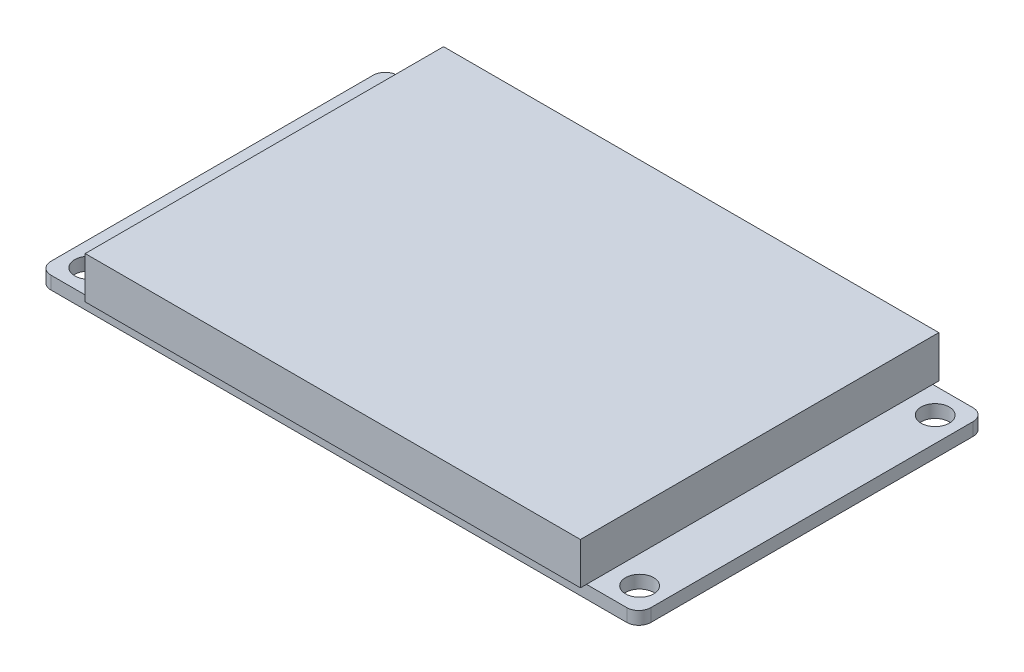
ISO-10303-21;
HEADER;
FILE_DESCRIPTION(('STEP AP214'),'2;1');
FILE_NAME('part.step','',(''),(''),'','','');
FILE_SCHEMA(('AUTOMOTIVE_DESIGN { 1 0 10303 214 1 1 1 1 }'));
ENDSEC;
DATA;
#1=APPLICATION_CONTEXT('core data for automotive mechanical design processes');
#2=APPLICATION_PROTOCOL_DEFINITION('international standard','automotive_design',2000,#1);
#3=PRODUCT_CONTEXT('',#1,'mechanical');
#4=PRODUCT('Part','Part','',(#3));
#5=PRODUCT_RELATED_PRODUCT_CATEGORY('part','',(#4));
#6=PRODUCT_DEFINITION_FORMATION('','',#4);
#7=PRODUCT_DEFINITION_CONTEXT('part definition',#1,'design');
#8=PRODUCT_DEFINITION('design','',#6,#7);
#9=PRODUCT_DEFINITION_SHAPE('','',#8);
#10=(LENGTH_UNIT() NAMED_UNIT(*) SI_UNIT(.MILLI.,.METRE.));
#11=(NAMED_UNIT(*) PLANE_ANGLE_UNIT() SI_UNIT($,.RADIAN.));
#12=(NAMED_UNIT(*) SI_UNIT($,.STERADIAN.) SOLID_ANGLE_UNIT());
#13=UNCERTAINTY_MEASURE_WITH_UNIT(LENGTH_MEASURE(1.E-05),#10,'distance_accuracy_value','');
#14=(GEOMETRIC_REPRESENTATION_CONTEXT(3) GLOBAL_UNCERTAINTY_ASSIGNED_CONTEXT((#13)) GLOBAL_UNIT_ASSIGNED_CONTEXT((#10,
#11,#12)) REPRESENTATION_CONTEXT('',''));
#15=CARTESIAN_POINT('',(0.,0.,0.));
#16=DIRECTION('',(0.,0.,1.));
#17=DIRECTION('',(1.,0.,0.));
#18=AXIS2_PLACEMENT_3D('',#15,#16,#17);
#19=CARTESIAN_POINT('',(73.,1.6,-1.5));
#20=DIRECTION('',(0.,-1.,0.));
#21=DIRECTION('',(0.,0.,-1.));
#22=AXIS2_PLACEMENT_3D('',#19,#20,#21);
#23=PLANE('',#22);
#24=CARTESIAN_POINT('',(71.45,1.6,-3.14999999999999));
#25=DIRECTION('',(0.,1.,0.));
#26=DIRECTION('',(0.,0.,1.));
#27=AXIS2_PLACEMENT_3D('',#24,#25,#26);
#28=CIRCLE('',#27,1.75);
#29=CARTESIAN_POINT('',(71.45,1.6,-1.4));
#30=VERTEX_POINT('',#29);
#31=EDGE_CURVE('E166',#30,#30,#28,.T.);
#32=ORIENTED_EDGE('',*,*,#31,.F.);
#33=EDGE_LOOP('',(#32));
#34=FACE_BOUND('',#33,.T.);
#35=CARTESIAN_POINT('',(71.45,1.6,-39.85));
#36=DIRECTION('',(0.,1.,0.));
#37=DIRECTION('',(0.,0.,1.));
#38=AXIS2_PLACEMENT_3D('',#35,#36,#37);
#39=CIRCLE('',#38,1.75);
#40=CARTESIAN_POINT('',(71.45,1.6,-38.1));
#41=VERTEX_POINT('',#40);
#42=EDGE_CURVE('E175',#41,#41,#39,.T.);
#43=ORIENTED_EDGE('',*,*,#42,.F.);
#44=EDGE_LOOP('',(#43));
#45=FACE_BOUND('',#44,.T.);
#46=DIRECTION('',(0.,0.,-1.));
#47=VECTOR('',#46,1.);
#48=CARTESIAN_POINT('',(68.,1.6,-43.75));
#49=LINE('',#48,#47);
#50=CARTESIAN_POINT('',(68.,1.6,0.));
#51=VERTEX_POINT('',#50);
#52=CARTESIAN_POINT('',(68.,1.6,-43.));
#53=VERTEX_POINT('',#52);
#54=EDGE_CURVE('E11',#51,#53,#49,.T.);
#55=ORIENTED_EDGE('',*,*,#54,.F.);
#56=DIRECTION('',(1.,0.,0.));
#57=VECTOR('',#56,1.);
#58=CARTESIAN_POINT('',(1.50000000000001,1.6,0.));
#59=LINE('',#58,#57);
#60=CARTESIAN_POINT('',(73.,1.6,0.));
#61=VERTEX_POINT('',#60);
#62=EDGE_CURVE('E211',#51,#61,#59,.T.);
#63=ORIENTED_EDGE('',*,*,#62,.T.);
#64=CARTESIAN_POINT('',(73.,1.6,-1.5));
#65=DIRECTION('',(0.,1.,0.));
#66=DIRECTION('',(0.,0.,-1.));
#67=AXIS2_PLACEMENT_3D('',#64,#65,#66);
#68=CIRCLE('',#67,1.5);
#69=CARTESIAN_POINT('',(74.5,1.6,-1.50000000000001));
#70=VERTEX_POINT('',#69);
#71=EDGE_CURVE('E193',#61,#70,#68,.T.);
#72=ORIENTED_EDGE('',*,*,#71,.T.);
#73=DIRECTION('',(0.,0.,-1.));
#74=VECTOR('',#73,1.);
#75=CARTESIAN_POINT('',(74.5,1.6,-1.50000000000001));
#76=LINE('',#75,#74);
#77=CARTESIAN_POINT('',(74.5,1.6,-41.5));
#78=VERTEX_POINT('',#77);
#79=EDGE_CURVE('E196',#70,#78,#76,.T.);
#80=ORIENTED_EDGE('',*,*,#79,.T.);
#81=CARTESIAN_POINT('',(73.,1.6,-41.5));
#82=DIRECTION('',(0.,1.,0.));
#83=DIRECTION('',(0.,0.,1.));
#84=AXIS2_PLACEMENT_3D('',#81,#82,#83);
#85=CIRCLE('',#84,1.5);
#86=CARTESIAN_POINT('',(73.,1.6,-43.));
#87=VERTEX_POINT('',#86);
#88=EDGE_CURVE('E199',#78,#87,#85,.T.);
#89=ORIENTED_EDGE('',*,*,#88,.T.);
#90=DIRECTION('',(-1.,0.,0.));
#91=VECTOR('',#90,1.);
#92=CARTESIAN_POINT('',(1.50000000000001,1.6,-43.));
#93=LINE('',#92,#91);
#94=EDGE_CURVE('E202',#87,#53,#93,.T.);
#95=ORIENTED_EDGE('',*,*,#94,.T.);
#96=EDGE_LOOP('',(#55,#63,#72,#80,#89,#95));
#97=FACE_BOUND('',#96,.T.);
#98=ADVANCED_FACE('F35',(#34,#45,#97),#23,.F.);
#99=CARTESIAN_POINT('',(3.04999999999999,1.6,-3.14999999999999));
#100=DIRECTION('',(0.,1.,0.));
#101=DIRECTION('',(0.,0.,1.));
#102=AXIS2_PLACEMENT_3D('',#99,#100,#101);
#103=CIRCLE('',#102,1.75);
#104=CARTESIAN_POINT('',(3.04999999999999,1.6,-1.39999999999999));
#105=VERTEX_POINT('',#104);
#106=EDGE_CURVE('E181',#105,#105,#103,.T.);
#107=ORIENTED_EDGE('',*,*,#106,.F.);
#108=EDGE_LOOP('',(#107));
#109=FACE_BOUND('',#108,.T.);
#110=CARTESIAN_POINT('',(3.04999999999999,1.6,-39.85));
#111=DIRECTION('',(0.,1.,0.));
#112=DIRECTION('',(0.,0.,1.));
#113=AXIS2_PLACEMENT_3D('',#110,#111,#112);
#114=CIRCLE('',#113,1.75);
#115=CARTESIAN_POINT('',(3.04999999999999,1.6,-38.1));
#116=VERTEX_POINT('',#115);
#117=EDGE_CURVE('E187',#116,#116,#114,.T.);
#118=ORIENTED_EDGE('',*,*,#117,.F.);
#119=EDGE_LOOP('',(#118));
#120=FACE_BOUND('',#119,.T.);
#121=DIRECTION('',(0.,0.,1.));
#122=VECTOR('',#121,1.);
#123=CARTESIAN_POINT('',(6.50000000000001,1.6,-43.75));
#124=LINE('',#123,#122);
#125=CARTESIAN_POINT('',(6.50000000000001,1.6,-43.));
#126=VERTEX_POINT('',#125);
#127=CARTESIAN_POINT('',(6.50000000000001,1.6,0.));
#128=VERTEX_POINT('',#127);
#129=EDGE_CURVE('E44',#126,#128,#124,.T.);
#130=ORIENTED_EDGE('',*,*,#129,.F.);
#131=CARTESIAN_POINT('',(1.50000000000001,1.6,-43.));
#132=VERTEX_POINT('',#131);
#133=EDGE_CURVE('E201',#126,#132,#93,.T.);
#134=ORIENTED_EDGE('',*,*,#133,.T.);
#135=CARTESIAN_POINT('',(1.5,1.6,-41.5));
#136=DIRECTION('',(0.,1.,0.));
#137=DIRECTION('',(0.,0.,1.));
#138=AXIS2_PLACEMENT_3D('',#135,#136,#137);
#139=CIRCLE('',#138,1.5);
#140=CARTESIAN_POINT('',(0.,1.6,-41.5));
#141=VERTEX_POINT('',#140);
#142=EDGE_CURVE('E204',#132,#141,#139,.T.);
#143=ORIENTED_EDGE('',*,*,#142,.T.);
#144=DIRECTION('',(0.,0.,1.));
#145=VECTOR('',#144,1.);
#146=CARTESIAN_POINT('',(0.,1.6,-1.50000000000001));
#147=LINE('',#146,#145);
#148=CARTESIAN_POINT('',(0.,1.6,-1.50000000000001));
#149=VERTEX_POINT('',#148);
#150=EDGE_CURVE('E207',#141,#149,#147,.T.);
#151=ORIENTED_EDGE('',*,*,#150,.T.);
#152=CARTESIAN_POINT('',(1.5,1.6,-1.5));
#153=DIRECTION('',(0.,1.,0.));
#154=DIRECTION('',(0.,0.,-1.));
#155=AXIS2_PLACEMENT_3D('',#152,#153,#154);
#156=CIRCLE('',#155,1.5);
#157=CARTESIAN_POINT('',(1.50000000000001,1.6,0.));
#158=VERTEX_POINT('',#157);
#159=EDGE_CURVE('E209',#149,#158,#156,.T.);
#160=ORIENTED_EDGE('',*,*,#159,.T.);
#161=EDGE_CURVE('E212',#158,#128,#59,.T.);
#162=ORIENTED_EDGE('',*,*,#161,.T.);
#163=EDGE_LOOP('',(#130,#134,#143,#151,#160,#162));
#164=FACE_BOUND('',#163,.T.);
#165=ADVANCED_FACE('F303',(#109,#120,#164),#23,.F.);
#166=CARTESIAN_POINT('',(73.,0.,-1.5));
#167=DIRECTION('',(0.,-1.,0.));
#168=DIRECTION('',(0.,0.,-1.));
#169=AXIS2_PLACEMENT_3D('',#166,#167,#168);
#170=PLANE('',#169);
#171=CARTESIAN_POINT('',(71.45,0.,-39.85));
#172=DIRECTION('',(0.,1.,0.));
#173=DIRECTION('',(0.,0.,1.));
#174=AXIS2_PLACEMENT_3D('',#171,#172,#173);
#175=CIRCLE('',#174,1.75);
#176=CARTESIAN_POINT('',(71.45,0.,-38.1));
#177=VERTEX_POINT('',#176);
#178=EDGE_CURVE('E173',#177,#177,#175,.T.);
#179=ORIENTED_EDGE('',*,*,#178,.T.);
#180=EDGE_LOOP('',(#179));
#181=FACE_BOUND('',#180,.T.);
#182=CARTESIAN_POINT('',(3.04999999999999,0.,-39.85));
#183=DIRECTION('',(0.,1.,0.));
#184=DIRECTION('',(0.,0.,1.));
#185=AXIS2_PLACEMENT_3D('',#182,#183,#184);
#186=CIRCLE('',#185,1.75);
#187=CARTESIAN_POINT('',(3.04999999999999,0.,-38.1));
#188=VERTEX_POINT('',#187);
#189=EDGE_CURVE('E184',#188,#188,#186,.T.);
#190=ORIENTED_EDGE('',*,*,#189,.T.);
#191=EDGE_LOOP('',(#190));
#192=FACE_BOUND('',#191,.T.);
#193=CARTESIAN_POINT('',(73.,0.,-1.5));
#194=DIRECTION('',(0.,1.,0.));
#195=DIRECTION('',(0.,0.,-1.));
#196=AXIS2_PLACEMENT_3D('',#193,#194,#195);
#197=CIRCLE('',#196,1.5);
#198=CARTESIAN_POINT('',(73.,0.,0.));
#199=VERTEX_POINT('',#198);
#200=CARTESIAN_POINT('',(74.5,0.,-1.50000000000001));
#201=VERTEX_POINT('',#200);
#202=EDGE_CURVE('E190',#199,#201,#197,.T.);
#203=ORIENTED_EDGE('',*,*,#202,.F.);
#204=DIRECTION('',(1.,0.,0.));
#205=VECTOR('',#204,1.);
#206=CARTESIAN_POINT('',(1.50000000000001,0.,0.));
#207=LINE('',#206,#205);
#208=CARTESIAN_POINT('',(1.50000000000001,0.,0.));
#209=VERTEX_POINT('',#208);
#210=EDGE_CURVE('E197',#209,#199,#207,.T.);
#211=ORIENTED_EDGE('',*,*,#210,.F.);
#212=CARTESIAN_POINT('',(1.5,0.,-1.5));
#213=DIRECTION('',(0.,1.,0.));
#214=DIRECTION('',(0.,0.,-1.));
#215=AXIS2_PLACEMENT_3D('',#212,#213,#214);
#216=CIRCLE('',#215,1.5);
#217=CARTESIAN_POINT('',(0.,0.,-1.50000000000001));
#218=VERTEX_POINT('',#217);
#219=EDGE_CURVE('E228',#218,#209,#216,.T.);
#220=ORIENTED_EDGE('',*,*,#219,.F.);
#221=DIRECTION('',(0.,0.,1.));
#222=VECTOR('',#221,1.);
#223=CARTESIAN_POINT('',(0.,0.,-1.50000000000001));
#224=LINE('',#223,#222);
#225=CARTESIAN_POINT('',(0.,0.,-41.5));
#226=VERTEX_POINT('',#225);
#227=EDGE_CURVE('E226',#226,#218,#224,.T.);
#228=ORIENTED_EDGE('',*,*,#227,.F.);
#229=CARTESIAN_POINT('',(1.5,0.,-41.5));
#230=DIRECTION('',(0.,1.,0.));
#231=DIRECTION('',(0.,0.,1.));
#232=AXIS2_PLACEMENT_3D('',#229,#230,#231);
#233=CIRCLE('',#232,1.5);
#234=CARTESIAN_POINT('',(1.50000000000001,0.,-43.));
#235=VERTEX_POINT('',#234);
#236=EDGE_CURVE('E224',#235,#226,#233,.T.);
#237=ORIENTED_EDGE('',*,*,#236,.F.);
#238=DIRECTION('',(-1.,0.,0.));
#239=VECTOR('',#238,1.);
#240=CARTESIAN_POINT('',(1.50000000000001,0.,-43.));
#241=LINE('',#240,#239);
#242=CARTESIAN_POINT('',(73.,0.,-43.));
#243=VERTEX_POINT('',#242);
#244=EDGE_CURVE('E222',#243,#235,#241,.T.);
#245=ORIENTED_EDGE('',*,*,#244,.F.);
#246=CARTESIAN_POINT('',(73.,0.,-41.5));
#247=DIRECTION('',(0.,1.,0.));
#248=DIRECTION('',(0.,0.,1.));
#249=AXIS2_PLACEMENT_3D('',#246,#247,#248);
#250=CIRCLE('',#249,1.5);
#251=CARTESIAN_POINT('',(74.5,0.,-41.5));
#252=VERTEX_POINT('',#251);
#253=EDGE_CURVE('E220',#252,#243,#250,.T.);
#254=ORIENTED_EDGE('',*,*,#253,.F.);
#255=DIRECTION('',(0.,0.,-1.));
#256=VECTOR('',#255,1.);
#257=CARTESIAN_POINT('',(74.5,0.,-1.50000000000001));
#258=LINE('',#257,#256);
#259=EDGE_CURVE('E218',#201,#252,#258,.T.);
#260=ORIENTED_EDGE('',*,*,#259,.F.);
#261=EDGE_LOOP('',(#203,#211,#220,#228,#237,#245,#254,#260));
#262=FACE_BOUND('',#261,.T.);
#263=CARTESIAN_POINT('',(3.04999999999999,0.,-3.14999999999999));
#264=DIRECTION('',(0.,1.,0.));
#265=DIRECTION('',(0.,0.,1.));
#266=AXIS2_PLACEMENT_3D('',#263,#264,#265);
#267=CIRCLE('',#266,1.75);
#268=CARTESIAN_POINT('',(3.04999999999999,0.,-1.39999999999999));
#269=VERTEX_POINT('',#268);
#270=EDGE_CURVE('E178',#269,#269,#267,.T.);
#271=ORIENTED_EDGE('',*,*,#270,.T.);
#272=EDGE_LOOP('',(#271));
#273=FACE_BOUND('',#272,.T.);
#274=CARTESIAN_POINT('',(71.45,0.,-3.14999999999999));
#275=DIRECTION('',(0.,1.,0.));
#276=DIRECTION('',(0.,0.,1.));
#277=AXIS2_PLACEMENT_3D('',#274,#275,#276);
#278=CIRCLE('',#277,1.75);
#279=CARTESIAN_POINT('',(71.45,0.,-1.4));
#280=VERTEX_POINT('',#279);
#281=EDGE_CURVE('E163',#280,#280,#278,.T.);
#282=ORIENTED_EDGE('',*,*,#281,.T.);
#283=EDGE_LOOP('',(#282));
#284=FACE_BOUND('',#283,.T.);
#285=ADVANCED_FACE('F289',(#181,#192,#262,#273,#284),#170,.T.);
#286=CARTESIAN_POINT('',(73.,1.6,-1.5));
#287=DIRECTION('',(0.,-1.,0.));
#288=DIRECTION('',(0.,0.,-1.));
#289=AXIS2_PLACEMENT_3D('',#286,#287,#288);
#290=CYLINDRICAL_SURFACE('',#289,1.5);
#291=ORIENTED_EDGE('',*,*,#202,.T.);
#292=DIRECTION('',(0.,-1.,0.));
#293=VECTOR('',#292,1.);
#294=CARTESIAN_POINT('',(74.5,1.6,-1.50000000000001));
#295=LINE('',#294,#293);
#296=EDGE_CURVE('E39',#70,#201,#295,.T.);
#297=ORIENTED_EDGE('',*,*,#296,.F.);
#298=ORIENTED_EDGE('',*,*,#71,.F.);
#299=DIRECTION('',(0.,-1.,0.));
#300=VECTOR('',#299,1.);
#301=CARTESIAN_POINT('',(73.,1.6,0.));
#302=LINE('',#301,#300);
#303=EDGE_CURVE('E214',#61,#199,#302,.T.);
#304=ORIENTED_EDGE('',*,*,#303,.T.);
#305=EDGE_LOOP('',(#291,#297,#298,#304));
#306=FACE_BOUND('',#305,.T.);
#307=ADVANCED_FACE('F37',(#306),#290,.T.);
#308=CARTESIAN_POINT('',(74.5,1.6,-1.50000000000001));
#309=DIRECTION('',(-1.,0.,0.));
#310=DIRECTION('',(0.,0.,1.));
#311=AXIS2_PLACEMENT_3D('',#308,#309,#310);
#312=PLANE('',#311);
#313=ORIENTED_EDGE('',*,*,#259,.T.);
#314=DIRECTION('',(0.,-1.,0.));
#315=VECTOR('',#314,1.);
#316=CARTESIAN_POINT('',(74.5,1.6,-41.5));
#317=LINE('',#316,#315);
#318=EDGE_CURVE('E247',#78,#252,#317,.T.);
#319=ORIENTED_EDGE('',*,*,#318,.F.);
#320=ORIENTED_EDGE('',*,*,#79,.F.);
#321=ORIENTED_EDGE('',*,*,#296,.T.);
#322=EDGE_LOOP('',(#313,#319,#320,#321));
#323=FACE_BOUND('',#322,.T.);
#324=ADVANCED_FACE('F293',(#323),#312,.F.);
#325=CARTESIAN_POINT('',(73.,1.6,-41.5));
#326=DIRECTION('',(0.,-1.,0.));
#327=DIRECTION('',(0.,0.,-1.));
#328=AXIS2_PLACEMENT_3D('',#325,#326,#327);
#329=CYLINDRICAL_SURFACE('',#328,1.5);
#330=ORIENTED_EDGE('',*,*,#253,.T.);
#331=DIRECTION('',(0.,-1.,0.));
#332=VECTOR('',#331,1.);
#333=CARTESIAN_POINT('',(73.,1.6,-43.));
#334=LINE('',#333,#332);
#335=EDGE_CURVE('E245',#87,#243,#334,.T.);
#336=ORIENTED_EDGE('',*,*,#335,.F.);
#337=ORIENTED_EDGE('',*,*,#88,.F.);
#338=ORIENTED_EDGE('',*,*,#318,.T.);
#339=EDGE_LOOP('',(#330,#336,#337,#338));
#340=FACE_BOUND('',#339,.T.);
#341=ADVANCED_FACE('F295',(#340),#329,.T.);
#342=CARTESIAN_POINT('',(1.50000000000001,1.6,-43.));
#343=DIRECTION('',(0.,0.,1.));
#344=DIRECTION('',(1.,0.,0.));
#345=AXIS2_PLACEMENT_3D('',#342,#343,#344);
#346=PLANE('',#345);
#347=ORIENTED_EDGE('',*,*,#244,.T.);
#348=DIRECTION('',(0.,-1.,0.));
#349=VECTOR('',#348,1.);
#350=CARTESIAN_POINT('',(1.50000000000001,1.6,-43.));
#351=LINE('',#350,#349);
#352=EDGE_CURVE('E242',#132,#235,#351,.T.);
#353=ORIENTED_EDGE('',*,*,#352,.F.);
#354=ORIENTED_EDGE('',*,*,#133,.F.);
#355=EDGE_CURVE('E205',#53,#126,#93,.T.);
#356=ORIENTED_EDGE('',*,*,#355,.F.);
#357=ORIENTED_EDGE('',*,*,#94,.F.);
#358=ORIENTED_EDGE('',*,*,#335,.T.);
#359=EDGE_LOOP('',(#347,#353,#354,#356,#357,#358));
#360=FACE_BOUND('',#359,.T.);
#361=ADVANCED_FACE('F306',(#360),#346,.F.);
#362=CARTESIAN_POINT('',(1.5,1.6,-41.5));
#363=DIRECTION('',(0.,-1.,0.));
#364=DIRECTION('',(0.,0.,-1.));
#365=AXIS2_PLACEMENT_3D('',#362,#363,#364);
#366=CYLINDRICAL_SURFACE('',#365,1.5);
#367=ORIENTED_EDGE('',*,*,#236,.T.);
#368=DIRECTION('',(0.,-1.,0.));
#369=VECTOR('',#368,1.);
#370=CARTESIAN_POINT('',(0.,1.6,-41.5));
#371=LINE('',#370,#369);
#372=EDGE_CURVE('E239',#141,#226,#371,.T.);
#373=ORIENTED_EDGE('',*,*,#372,.F.);
#374=ORIENTED_EDGE('',*,*,#142,.F.);
#375=ORIENTED_EDGE('',*,*,#352,.T.);
#376=EDGE_LOOP('',(#367,#373,#374,#375));
#377=FACE_BOUND('',#376,.T.);
#378=ADVANCED_FACE('F309',(#377),#366,.T.);
#379=CARTESIAN_POINT('',(0.,1.6,-1.50000000000001));
#380=DIRECTION('',(1.,0.,0.));
#381=DIRECTION('',(0.,0.,-1.));
#382=AXIS2_PLACEMENT_3D('',#379,#380,#381);
#383=PLANE('',#382);
#384=ORIENTED_EDGE('',*,*,#227,.T.);
#385=DIRECTION('',(0.,-1.,0.));
#386=VECTOR('',#385,1.);
#387=CARTESIAN_POINT('',(0.,1.6,-1.50000000000001));
#388=LINE('',#387,#386);
#389=EDGE_CURVE('E236',#149,#218,#388,.T.);
#390=ORIENTED_EDGE('',*,*,#389,.F.);
#391=ORIENTED_EDGE('',*,*,#150,.F.);
#392=ORIENTED_EDGE('',*,*,#372,.T.);
#393=EDGE_LOOP('',(#384,#390,#391,#392));
#394=FACE_BOUND('',#393,.T.);
#395=ADVANCED_FACE('F314',(#394),#383,.F.);
#396=CARTESIAN_POINT('',(1.5,1.6,-1.5));
#397=DIRECTION('',(0.,-1.,0.));
#398=DIRECTION('',(0.,0.,-1.));
#399=AXIS2_PLACEMENT_3D('',#396,#397,#398);
#400=CYLINDRICAL_SURFACE('',#399,1.5);
#401=ORIENTED_EDGE('',*,*,#219,.T.);
#402=DIRECTION('',(0.,-1.,0.));
#403=VECTOR('',#402,1.);
#404=CARTESIAN_POINT('',(1.50000000000001,1.6,0.));
#405=LINE('',#404,#403);
#406=EDGE_CURVE('E233',#158,#209,#405,.T.);
#407=ORIENTED_EDGE('',*,*,#406,.F.);
#408=ORIENTED_EDGE('',*,*,#159,.F.);
#409=ORIENTED_EDGE('',*,*,#389,.T.);
#410=EDGE_LOOP('',(#401,#407,#408,#409));
#411=FACE_BOUND('',#410,.T.);
#412=ADVANCED_FACE('F318',(#411),#400,.T.);
#413=CARTESIAN_POINT('',(1.50000000000001,1.6,0.));
#414=DIRECTION('',(0.,0.,-1.));
#415=DIRECTION('',(-1.,0.,0.));
#416=AXIS2_PLACEMENT_3D('',#413,#414,#415);
#417=PLANE('',#416);
#418=ORIENTED_EDGE('',*,*,#210,.T.);
#419=ORIENTED_EDGE('',*,*,#303,.F.);
#420=ORIENTED_EDGE('',*,*,#62,.F.);
#421=EDGE_CURVE('E215',#128,#51,#59,.T.);
#422=ORIENTED_EDGE('',*,*,#421,.F.);
#423=ORIENTED_EDGE('',*,*,#161,.F.);
#424=ORIENTED_EDGE('',*,*,#406,.T.);
#425=EDGE_LOOP('',(#418,#419,#420,#422,#423,#424));
#426=FACE_BOUND('',#425,.T.);
#427=ADVANCED_FACE('F284',(#426),#417,.F.);
#428=CARTESIAN_POINT('',(3.04999999999999,1.6,-39.85));
#429=DIRECTION('',(0.,-1.,0.));
#430=DIRECTION('',(0.,0.,-1.));
#431=AXIS2_PLACEMENT_3D('',#428,#429,#430);
#432=CYLINDRICAL_SURFACE('',#431,1.75);
#433=ORIENTED_EDGE('',*,*,#117,.T.);
#434=EDGE_LOOP('',(#433));
#435=FACE_BOUND('',#434,.T.);
#436=ORIENTED_EDGE('',*,*,#189,.F.);
#437=EDGE_LOOP('',(#436));
#438=FACE_BOUND('',#437,.T.);
#439=ADVANCED_FACE('F325',(#435,#438),#432,.F.);
#440=CARTESIAN_POINT('',(3.04999999999999,1.6,-3.14999999999999));
#441=DIRECTION('',(0.,-1.,0.));
#442=DIRECTION('',(0.,0.,-1.));
#443=AXIS2_PLACEMENT_3D('',#440,#441,#442);
#444=CYLINDRICAL_SURFACE('',#443,1.75);
#445=ORIENTED_EDGE('',*,*,#106,.T.);
#446=EDGE_LOOP('',(#445));
#447=FACE_BOUND('',#446,.T.);
#448=ORIENTED_EDGE('',*,*,#270,.F.);
#449=EDGE_LOOP('',(#448));
#450=FACE_BOUND('',#449,.T.);
#451=ADVANCED_FACE('F350',(#447,#450),#444,.F.);
#452=CARTESIAN_POINT('',(71.45,1.6,-39.85));
#453=DIRECTION('',(0.,-1.,0.));
#454=DIRECTION('',(0.,0.,-1.));
#455=AXIS2_PLACEMENT_3D('',#452,#453,#454);
#456=CYLINDRICAL_SURFACE('',#455,1.75);
#457=ORIENTED_EDGE('',*,*,#42,.T.);
#458=EDGE_LOOP('',(#457));
#459=FACE_BOUND('',#458,.T.);
#460=ORIENTED_EDGE('',*,*,#178,.F.);
#461=EDGE_LOOP('',(#460));
#462=FACE_BOUND('',#461,.T.);
#463=ADVANCED_FACE('F355',(#459,#462),#456,.F.);
#464=CARTESIAN_POINT('',(71.45,1.6,-3.14999999999999));
#465=DIRECTION('',(0.,-1.,0.));
#466=DIRECTION('',(0.,0.,-1.));
#467=AXIS2_PLACEMENT_3D('',#464,#465,#466);
#468=CYLINDRICAL_SURFACE('',#467,1.75);
#469=ORIENTED_EDGE('',*,*,#31,.T.);
#470=EDGE_LOOP('',(#469));
#471=FACE_BOUND('',#470,.T.);
#472=ORIENTED_EDGE('',*,*,#281,.F.);
#473=EDGE_LOOP('',(#472));
#474=FACE_BOUND('',#473,.T.);
#475=ADVANCED_FACE('F362',(#471,#474),#468,.F.);
#476=CARTESIAN_POINT('',(0.,1.6,0.));
#477=DIRECTION('',(0.,1.,0.));
#478=DIRECTION('',(0.,0.,1.));
#479=AXIS2_PLACEMENT_3D('',#476,#477,#478);
#480=PLANE('',#479);
#481=CARTESIAN_POINT('',(68.,1.6,-43.75));
#482=VERTEX_POINT('',#481);
#483=EDGE_CURVE('E47',#53,#482,#49,.T.);
#484=ORIENTED_EDGE('',*,*,#483,.F.);
#485=ORIENTED_EDGE('',*,*,#355,.T.);
#486=CARTESIAN_POINT('',(6.50000000000001,1.6,-43.75));
#487=VERTEX_POINT('',#486);
#488=EDGE_CURVE('E257',#487,#126,#124,.T.);
#489=ORIENTED_EDGE('',*,*,#488,.F.);
#490=DIRECTION('',(-1.,0.,0.));
#491=VECTOR('',#490,1.);
#492=CARTESIAN_POINT('',(6.50000000000001,1.6,-43.75));
#493=LINE('',#492,#491);
#494=EDGE_CURVE('E263',#482,#487,#493,.T.);
#495=ORIENTED_EDGE('',*,*,#494,.F.);
#496=EDGE_LOOP('',(#484,#485,#489,#495));
#497=FACE_BOUND('',#496,.T.);
#498=ADVANCED_FACE('F300',(#497),#480,.F.);
#499=CARTESIAN_POINT('',(6.50000000000001,1.6,0.749999999999987));
#500=VERTEX_POINT('',#499);
#501=EDGE_CURVE('E258',#128,#500,#124,.T.);
#502=ORIENTED_EDGE('',*,*,#501,.F.);
#503=ORIENTED_EDGE('',*,*,#421,.T.);
#504=CARTESIAN_POINT('',(68.,1.6,0.749999999999987));
#505=VERTEX_POINT('',#504);
#506=EDGE_CURVE('E46',#505,#51,#49,.T.);
#507=ORIENTED_EDGE('',*,*,#506,.F.);
#508=DIRECTION('',(1.,0.,0.));
#509=VECTOR('',#508,1.);
#510=CARTESIAN_POINT('',(6.50000000000001,1.6,0.749999999999987));
#511=LINE('',#510,#509);
#512=EDGE_CURVE('E157',#500,#505,#511,.T.);
#513=ORIENTED_EDGE('',*,*,#512,.F.);
#514=EDGE_LOOP('',(#502,#503,#507,#513));
#515=FACE_BOUND('',#514,.T.);
#516=ADVANCED_FACE('F278',(#515),#480,.F.);
#517=CARTESIAN_POINT('',(68.,6.8,-43.75));
#518=DIRECTION('',(-1.,0.,0.));
#519=DIRECTION('',(0.,0.,1.));
#520=AXIS2_PLACEMENT_3D('',#517,#518,#519);
#521=PLANE('',#520);
#522=ORIENTED_EDGE('',*,*,#506,.T.);
#523=ORIENTED_EDGE('',*,*,#54,.T.);
#524=ORIENTED_EDGE('',*,*,#483,.T.);
#525=DIRECTION('',(0.,-1.,0.));
#526=VECTOR('',#525,1.);
#527=CARTESIAN_POINT('',(68.,6.8,-43.75));
#528=LINE('',#527,#526);
#529=CARTESIAN_POINT('',(68.,6.8,-43.75));
#530=VERTEX_POINT('',#529);
#531=EDGE_CURVE('E142',#530,#482,#528,.T.);
#532=ORIENTED_EDGE('',*,*,#531,.F.);
#533=DIRECTION('',(0.,0.,-1.));
#534=VECTOR('',#533,1.);
#535=CARTESIAN_POINT('',(68.,6.8,-43.75));
#536=LINE('',#535,#534);
#537=CARTESIAN_POINT('',(68.,6.8,0.749999999999987));
#538=VERTEX_POINT('',#537);
#539=EDGE_CURVE('E148',#538,#530,#536,.T.);
#540=ORIENTED_EDGE('',*,*,#539,.F.);
#541=DIRECTION('',(0.,-1.,0.));
#542=VECTOR('',#541,1.);
#543=CARTESIAN_POINT('',(68.,6.8,0.749999999999987));
#544=LINE('',#543,#542);
#545=EDGE_CURVE('E269',#538,#505,#544,.T.);
#546=ORIENTED_EDGE('',*,*,#545,.T.);
#547=EDGE_LOOP('',(#522,#523,#524,#532,#540,#546));
#548=FACE_BOUND('',#547,.T.);
#549=ADVANCED_FACE('F160',(#548),#521,.F.);
#550=CARTESIAN_POINT('',(6.50000000000001,6.8,-43.75));
#551=DIRECTION('',(0.,0.,1.));
#552=DIRECTION('',(1.,0.,0.));
#553=AXIS2_PLACEMENT_3D('',#550,#551,#552);
#554=PLANE('',#553);
#555=ORIENTED_EDGE('',*,*,#494,.T.);
#556=DIRECTION('',(0.,-1.,0.));
#557=VECTOR('',#556,1.);
#558=CARTESIAN_POINT('',(6.50000000000001,6.8,-43.75));
#559=LINE('',#558,#557);
#560=CARTESIAN_POINT('',(6.50000000000001,6.8,-43.75));
#561=VERTEX_POINT('',#560);
#562=EDGE_CURVE('E144',#561,#487,#559,.T.);
#563=ORIENTED_EDGE('',*,*,#562,.F.);
#564=DIRECTION('',(-1.,0.,0.));
#565=VECTOR('',#564,1.);
#566=CARTESIAN_POINT('',(6.50000000000001,6.8,-43.75));
#567=LINE('',#566,#565);
#568=EDGE_CURVE('E138',#530,#561,#567,.T.);
#569=ORIENTED_EDGE('',*,*,#568,.F.);
#570=ORIENTED_EDGE('',*,*,#531,.T.);
#571=EDGE_LOOP('',(#555,#563,#569,#570));
#572=FACE_BOUND('',#571,.T.);
#573=ADVANCED_FACE('F140',(#572),#554,.F.);
#574=CARTESIAN_POINT('',(6.50000000000001,6.8,-43.75));
#575=DIRECTION('',(1.,0.,0.));
#576=DIRECTION('',(0.,0.,-1.));
#577=AXIS2_PLACEMENT_3D('',#574,#575,#576);
#578=PLANE('',#577);
#579=ORIENTED_EDGE('',*,*,#488,.T.);
#580=ORIENTED_EDGE('',*,*,#129,.T.);
#581=ORIENTED_EDGE('',*,*,#501,.T.);
#582=DIRECTION('',(0.,-1.,0.));
#583=VECTOR('',#582,1.);
#584=CARTESIAN_POINT('',(6.50000000000001,6.8,0.749999999999987));
#585=LINE('',#584,#583);
#586=CARTESIAN_POINT('',(6.50000000000001,6.8,0.749999999999987));
#587=VERTEX_POINT('',#586);
#588=EDGE_CURVE('E168',#587,#500,#585,.T.);
#589=ORIENTED_EDGE('',*,*,#588,.F.);
#590=DIRECTION('',(0.,0.,1.));
#591=VECTOR('',#590,1.);
#592=CARTESIAN_POINT('',(6.50000000000001,6.8,-43.75));
#593=LINE('',#592,#591);
#594=EDGE_CURVE('E147',#561,#587,#593,.T.);
#595=ORIENTED_EDGE('',*,*,#594,.F.);
#596=ORIENTED_EDGE('',*,*,#562,.T.);
#597=EDGE_LOOP('',(#579,#580,#581,#589,#595,#596));
#598=FACE_BOUND('',#597,.T.);
#599=ADVANCED_FACE('F270',(#598),#578,.F.);
#600=CARTESIAN_POINT('',(6.50000000000001,6.8,0.749999999999987));
#601=DIRECTION('',(0.,0.,-1.));
#602=DIRECTION('',(-1.,0.,0.));
#603=AXIS2_PLACEMENT_3D('',#600,#601,#602);
#604=PLANE('',#603);
#605=ORIENTED_EDGE('',*,*,#512,.T.);
#606=ORIENTED_EDGE('',*,*,#545,.F.);
#607=DIRECTION('',(1.,0.,0.));
#608=VECTOR('',#607,1.);
#609=CARTESIAN_POINT('',(6.50000000000001,6.8,0.749999999999987));
#610=LINE('',#609,#608);
#611=EDGE_CURVE('E153',#587,#538,#610,.T.);
#612=ORIENTED_EDGE('',*,*,#611,.F.);
#613=ORIENTED_EDGE('',*,*,#588,.T.);
#614=EDGE_LOOP('',(#605,#606,#612,#613));
#615=FACE_BOUND('',#614,.T.);
#616=ADVANCED_FACE('F273',(#615),#604,.F.);
#617=CARTESIAN_POINT('',(0.,6.8,0.));
#618=DIRECTION('',(0.,1.,0.));
#619=DIRECTION('',(0.,0.,1.));
#620=AXIS2_PLACEMENT_3D('',#617,#618,#619);
#621=PLANE('',#620);
#622=ORIENTED_EDGE('',*,*,#539,.T.);
#623=ORIENTED_EDGE('',*,*,#568,.T.);
#624=ORIENTED_EDGE('',*,*,#594,.T.);
#625=ORIENTED_EDGE('',*,*,#611,.T.);
#626=EDGE_LOOP('',(#622,#623,#624,#625));
#627=FACE_BOUND('',#626,.T.);
#628=ADVANCED_FACE('F151',(#627),#621,.T.);
#629=CLOSED_SHELL('',(#98,#165,#285,#307,#324,#341,#361,#378,#395,#412,#427,#439,#451,#463,#475,
#498,#516,#549,#573,#599,#616,#628));
#630=MANIFOLD_SOLID_BREP('B2',#629);
#631=ADVANCED_BREP_SHAPE_REPRESENTATION('',(#18,#630),#14);
#632=SHAPE_DEFINITION_REPRESENTATION(#9,#631);
ENDSEC;
END-ISO-10303-21;
